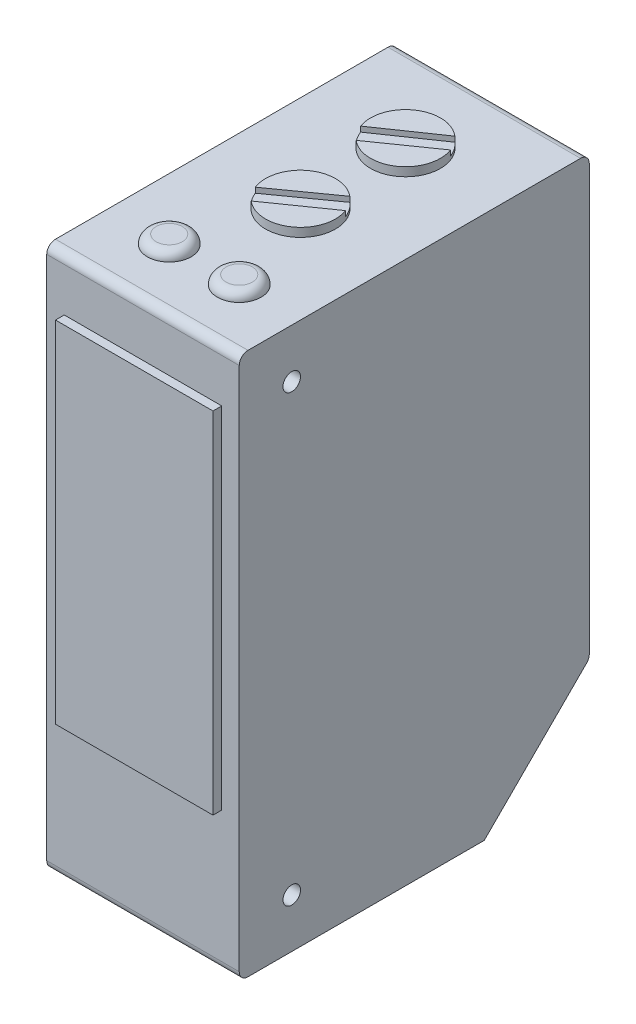
ISO-10303-21;
HEADER;
FILE_DESCRIPTION(('STEP AP214'),'2;1');
FILE_NAME('part.step','',(''),(''),'','','');
FILE_SCHEMA(('AUTOMOTIVE_DESIGN { 1 0 10303 214 1 1 1 1 }'));
ENDSEC;
DATA;
#1=APPLICATION_CONTEXT('core data for automotive mechanical design processes');
#2=APPLICATION_PROTOCOL_DEFINITION('international standard','automotive_design',2000,#1);
#3=PRODUCT_CONTEXT('',#1,'mechanical');
#4=PRODUCT('Part','Part','',(#3));
#5=PRODUCT_RELATED_PRODUCT_CATEGORY('part','',(#4));
#6=PRODUCT_DEFINITION_FORMATION('','',#4);
#7=PRODUCT_DEFINITION_CONTEXT('part definition',#1,'design');
#8=PRODUCT_DEFINITION('design','',#6,#7);
#9=PRODUCT_DEFINITION_SHAPE('','',#8);
#10=(LENGTH_UNIT() NAMED_UNIT(*) SI_UNIT(.MILLI.,.METRE.));
#11=(NAMED_UNIT(*) PLANE_ANGLE_UNIT() SI_UNIT($,.RADIAN.));
#12=(NAMED_UNIT(*) SI_UNIT($,.STERADIAN.) SOLID_ANGLE_UNIT());
#13=UNCERTAINTY_MEASURE_WITH_UNIT(LENGTH_MEASURE(1.E-05),#10,'distance_accuracy_value','');
#14=(GEOMETRIC_REPRESENTATION_CONTEXT(3) GLOBAL_UNCERTAINTY_ASSIGNED_CONTEXT((#13)) GLOBAL_UNIT_ASSIGNED_CONTEXT((#10,
#11,#12)) REPRESENTATION_CONTEXT('',''));
#15=CARTESIAN_POINT('',(0.,0.,0.));
#16=DIRECTION('',(0.,0.,1.));
#17=DIRECTION('',(1.,0.,0.));
#18=AXIS2_PLACEMENT_3D('',#15,#16,#17);
#19=CARTESIAN_POINT('',(5.5,31.5,-15.));
#20=DIRECTION('',(0.,1.,0.));
#21=DIRECTION('',(0.,0.,1.));
#22=AXIS2_PLACEMENT_3D('',#19,#20,#21);
#23=PLANE('',#22);
#24=DIRECTION('',(-0.824126188622013,0.,0.566406236924836));
#25=VECTOR('',#24,1.);
#26=CARTESIAN_POINT('',(3.62088337968436,31.5,-14.3152221329121));
#27=LINE('',#26,#25);
#28=CARTESIAN_POINT('',(6.81271038339081,31.5,-16.50890405571));
#29=VERTEX_POINT('',#28);
#30=CARTESIAN_POINT('',(3.62088337968436,31.5,-14.3152221329121));
#31=VERTEX_POINT('',#30);
#32=EDGE_CURVE('E220',#29,#31,#27,.T.);
#33=ORIENTED_EDGE('',*,*,#32,.F.);
#34=CARTESIAN_POINT('',(5.5,31.5,-15.));
#35=DIRECTION('',(0.,1.,0.));
#36=DIRECTION('',(0.,0.,1.));
#37=AXIS2_PLACEMENT_3D('',#34,#35,#36);
#38=CIRCLE('',#37,2.);
#39=EDGE_CURVE('E259',#29,#31,#38,.T.);
#40=ORIENTED_EDGE('',*,*,#39,.T.);
#41=EDGE_LOOP('',(#33,#40));
#42=FACE_BOUND('',#41,.T.);
#43=ADVANCED_FACE('F39',(#42),#23,.T.);
#44=CARTESIAN_POINT('',(5.5,31.5,-9.));
#45=DIRECTION('',(0.,1.,0.));
#46=DIRECTION('',(0.,0.,1.));
#47=AXIS2_PLACEMENT_3D('',#44,#45,#46);
#48=PLANE('',#47);
#49=DIRECTION('',(0.819152044288989,0.,-0.57357643635105));
#50=VECTOR('',#49,1.);
#51=CARTESIAN_POINT('',(4.20050710540402,31.5,-7.4796979849732));
#52=LINE('',#51,#50);
#53=CARTESIAN_POINT('',(4.20050710540401,31.5,-7.4796979849732));
#54=VERTEX_POINT('',#53);
#55=CARTESIAN_POINT('',(7.37306933094703,31.5,-9.70114997073782));
#56=VERTEX_POINT('',#55);
#57=EDGE_CURVE('E199',#54,#56,#52,.T.);
#58=ORIENTED_EDGE('',*,*,#57,.F.);
#59=CARTESIAN_POINT('',(5.5,31.5,-9.));
#60=DIRECTION('',(0.,1.,0.));
#61=DIRECTION('',(0.,0.,1.));
#62=AXIS2_PLACEMENT_3D('',#59,#60,#61);
#63=CIRCLE('',#62,2.);
#64=EDGE_CURVE('E250',#54,#56,#63,.T.);
#65=ORIENTED_EDGE('',*,*,#64,.T.);
#66=EDGE_LOOP('',(#58,#65));
#67=FACE_BOUND('',#66,.T.);
#68=ADVANCED_FACE('F482',(#67),#48,.T.);
#69=CARTESIAN_POINT('',(11.,0.,0.));
#70=DIRECTION('',(0.,0.,-1.));
#71=DIRECTION('',(-1.,0.,0.));
#72=AXIS2_PLACEMENT_3D('',#69,#70,#71);
#73=PLANE('',#72);
#74=DIRECTION('',(0.,-1.,0.));
#75=VECTOR('',#74,1.);
#76=CARTESIAN_POINT('',(0.,0.,0.));
#77=LINE('',#76,#75);
#78=CARTESIAN_POINT('',(0.,30.5,0.));
#79=VERTEX_POINT('',#78);
#80=CARTESIAN_POINT('',(0.,0.5,0.));
#81=VERTEX_POINT('',#80);
#82=EDGE_CURVE('E323',#79,#81,#77,.T.);
#83=ORIENTED_EDGE('',*,*,#82,.T.);
#84=DIRECTION('',(-1.,0.,0.));
#85=VECTOR('',#84,1.);
#86=CARTESIAN_POINT('',(11.,0.5,0.));
#87=LINE('',#86,#85);
#88=CARTESIAN_POINT('',(11.,0.5,0.));
#89=VERTEX_POINT('',#88);
#90=EDGE_CURVE('E417',#81,#89,#87,.F.);
#91=ORIENTED_EDGE('',*,*,#90,.T.);
#92=DIRECTION('',(0.,-1.,0.));
#93=VECTOR('',#92,1.);
#94=CARTESIAN_POINT('',(11.,0.,0.));
#95=LINE('',#94,#93);
#96=CARTESIAN_POINT('',(11.,30.5,0.));
#97=VERTEX_POINT('',#96);
#98=EDGE_CURVE('E333',#97,#89,#95,.T.);
#99=ORIENTED_EDGE('',*,*,#98,.F.);
#100=DIRECTION('',(-1.,0.,0.));
#101=VECTOR('',#100,1.);
#102=CARTESIAN_POINT('',(11.,30.5,0.));
#103=LINE('',#102,#101);
#104=EDGE_CURVE('E380',#97,#79,#103,.T.);
#105=ORIENTED_EDGE('',*,*,#104,.T.);
#106=EDGE_LOOP('',(#83,#91,#99,#105));
#107=FACE_BOUND('',#106,.T.);
#108=DIRECTION('',(1.,0.,0.));
#109=VECTOR('',#108,1.);
#110=CARTESIAN_POINT('',(1.,8.,0.));
#111=LINE('',#110,#109);
#112=CARTESIAN_POINT('',(1.,8.,0.));
#113=VERTEX_POINT('',#112);
#114=CARTESIAN_POINT('',(10.,8.,0.));
#115=VERTEX_POINT('',#114);
#116=EDGE_CURVE('E276',#113,#115,#111,.T.);
#117=ORIENTED_EDGE('',*,*,#116,.F.);
#118=DIRECTION('',(0.,-1.,0.));
#119=VECTOR('',#118,1.);
#120=CARTESIAN_POINT('',(0.999999999999997,28.,0.));
#121=LINE('',#120,#119);
#122=CARTESIAN_POINT('',(0.999999999999997,28.,0.));
#123=VERTEX_POINT('',#122);
#124=EDGE_CURVE('E264',#123,#113,#121,.T.);
#125=ORIENTED_EDGE('',*,*,#124,.F.);
#126=DIRECTION('',(1.,0.,0.));
#127=VECTOR('',#126,1.);
#128=CARTESIAN_POINT('',(0.999999999999997,28.,0.));
#129=LINE('',#128,#127);
#130=CARTESIAN_POINT('',(10.,28.,0.));
#131=VERTEX_POINT('',#130);
#132=EDGE_CURVE('E283',#123,#131,#129,.T.);
#133=ORIENTED_EDGE('',*,*,#132,.T.);
#134=DIRECTION('',(0.,-1.,0.));
#135=VECTOR('',#134,1.);
#136=CARTESIAN_POINT('',(10.,28.,0.));
#137=LINE('',#136,#135);
#138=EDGE_CURVE('E279',#131,#115,#137,.T.);
#139=ORIENTED_EDGE('',*,*,#138,.T.);
#140=EDGE_LOOP('',(#117,#125,#133,#139));
#141=FACE_BOUND('',#140,.T.);
#142=ADVANCED_FACE('F465',(#107,#141),#73,.F.);
#143=CARTESIAN_POINT('',(11.,0.,-14.));
#144=DIRECTION('',(0.,1.,0.));
#145=DIRECTION('',(0.,0.,1.));
#146=AXIS2_PLACEMENT_3D('',#143,#144,#145);
#147=PLANE('',#146);
#148=DIRECTION('',(0.,0.,-1.));
#149=VECTOR('',#148,1.);
#150=CARTESIAN_POINT('',(11.,0.,-14.));
#151=LINE('',#150,#149);
#152=CARTESIAN_POINT('',(11.,0.,-0.500000000000004));
#153=VERTEX_POINT('',#152);
#154=CARTESIAN_POINT('',(11.,0.,-14.));
#155=VERTEX_POINT('',#154);
#156=EDGE_CURVE('E319',#153,#155,#151,.T.);
#157=ORIENTED_EDGE('',*,*,#156,.F.);
#158=DIRECTION('',(-1.,0.,0.));
#159=VECTOR('',#158,1.);
#160=CARTESIAN_POINT('',(11.,0.,-0.5));
#161=LINE('',#160,#159);
#162=CARTESIAN_POINT('',(0.,0.,-0.500000000000004));
#163=VERTEX_POINT('',#162);
#164=EDGE_CURVE('E410',#153,#163,#161,.T.);
#165=ORIENTED_EDGE('',*,*,#164,.T.);
#166=DIRECTION('',(0.,0.,-1.));
#167=VECTOR('',#166,1.);
#168=CARTESIAN_POINT('',(0.,0.,-14.));
#169=LINE('',#168,#167);
#170=CARTESIAN_POINT('',(0.,0.,-14.));
#171=VERTEX_POINT('',#170);
#172=EDGE_CURVE('E307',#163,#171,#169,.T.);
#173=ORIENTED_EDGE('',*,*,#172,.T.);
#174=DIRECTION('',(-1.,0.,0.));
#175=VECTOR('',#174,1.);
#176=CARTESIAN_POINT('',(11.,0.,-14.));
#177=LINE('',#176,#175);
#178=EDGE_CURVE('E337',#155,#171,#177,.T.);
#179=ORIENTED_EDGE('',*,*,#178,.F.);
#180=EDGE_LOOP('',(#157,#165,#173,#179));
#181=FACE_BOUND('',#180,.T.);
#182=ADVANCED_FACE('F473',(#181),#147,.F.);
#183=CARTESIAN_POINT('',(11.,6.,-20.));
#184=DIRECTION('',(0.,0.707106781186546,0.707106781186549));
#185=DIRECTION('',(0.,-0.707106781186549,0.707106781186546));
#186=AXIS2_PLACEMENT_3D('',#183,#184,#185);
#187=PLANE('',#186);
#188=DIRECTION('',(0.,0.707106781186549,-0.707106781186546));
#189=VECTOR('',#188,1.);
#190=CARTESIAN_POINT('',(0.,6.,-20.));
#191=LINE('',#190,#189);
#192=CARTESIAN_POINT('',(0.,5.85355339059327,-19.8535533905933));
#193=VERTEX_POINT('',#192);
#194=EDGE_CURVE('E340',#171,#193,#191,.T.);
#195=ORIENTED_EDGE('',*,*,#194,.T.);
#196=DIRECTION('',(-1.,0.,0.));
#197=VECTOR('',#196,1.);
#198=CARTESIAN_POINT('',(11.,5.85355339059327,-19.8535533905933));
#199=LINE('',#198,#197);
#200=CARTESIAN_POINT('',(11.,5.85355339059327,-19.8535533905933));
#201=VERTEX_POINT('',#200);
#202=EDGE_CURVE('E48',#193,#201,#199,.F.);
#203=ORIENTED_EDGE('',*,*,#202,.T.);
#204=DIRECTION('',(0.,0.707106781186549,-0.707106781186546));
#205=VECTOR('',#204,1.);
#206=CARTESIAN_POINT('',(11.,6.,-20.));
#207=LINE('',#206,#205);
#208=EDGE_CURVE('E322',#155,#201,#207,.T.);
#209=ORIENTED_EDGE('',*,*,#208,.F.);
#210=ORIENTED_EDGE('',*,*,#178,.T.);
#211=EDGE_LOOP('',(#195,#203,#209,#210));
#212=FACE_BOUND('',#211,.T.);
#213=ADVANCED_FACE('F433',(#212),#187,.F.);
#214=CARTESIAN_POINT('',(11.,31.,-20.));
#215=DIRECTION('',(0.,0.,1.));
#216=DIRECTION('',(0.,-1.,0.));
#217=AXIS2_PLACEMENT_3D('',#214,#215,#216);
#218=PLANE('',#217);
#219=DIRECTION('',(0.,1.,0.));
#220=VECTOR('',#219,1.);
#221=CARTESIAN_POINT('',(11.,31.,-20.));
#222=LINE('',#221,#220);
#223=CARTESIAN_POINT('',(11.,6.20710678118655,-20.));
#224=VERTEX_POINT('',#223);
#225=CARTESIAN_POINT('',(11.,30.5,-20.));
#226=VERTEX_POINT('',#225);
#227=EDGE_CURVE('E327',#224,#226,#222,.T.);
#228=ORIENTED_EDGE('',*,*,#227,.F.);
#229=DIRECTION('',(-1.,0.,0.));
#230=VECTOR('',#229,1.);
#231=CARTESIAN_POINT('',(11.,6.20710678118655,-20.));
#232=LINE('',#231,#230);
#233=CARTESIAN_POINT('',(0.,6.20710678118655,-20.));
#234=VERTEX_POINT('',#233);
#235=EDGE_CURVE('E423',#224,#234,#232,.T.);
#236=ORIENTED_EDGE('',*,*,#235,.T.);
#237=DIRECTION('',(0.,1.,0.));
#238=VECTOR('',#237,1.);
#239=CARTESIAN_POINT('',(0.,31.,-20.));
#240=LINE('',#239,#238);
#241=CARTESIAN_POINT('',(0.,30.5,-20.));
#242=VERTEX_POINT('',#241);
#243=EDGE_CURVE('E344',#234,#242,#240,.T.);
#244=ORIENTED_EDGE('',*,*,#243,.T.);
#245=DIRECTION('',(-1.,0.,0.));
#246=VECTOR('',#245,1.);
#247=CARTESIAN_POINT('',(11.,30.5,-20.));
#248=LINE('',#247,#246);
#249=EDGE_CURVE('E403',#242,#226,#248,.F.);
#250=ORIENTED_EDGE('',*,*,#249,.T.);
#251=EDGE_LOOP('',(#228,#236,#244,#250));
#252=FACE_BOUND('',#251,.T.);
#253=ADVANCED_FACE('F445',(#252),#218,.F.);
#254=CARTESIAN_POINT('',(11.,31.,0.));
#255=DIRECTION('',(0.,-1.,0.));
#256=DIRECTION('',(0.,0.,-1.));
#257=AXIS2_PLACEMENT_3D('',#254,#255,#256);
#258=PLANE('',#257);
#259=CARTESIAN_POINT('',(5.5,31.,-9.));
#260=DIRECTION('',(0.,-1.,0.));
#261=DIRECTION('',(0.,0.,-1.));
#262=AXIS2_PLACEMENT_3D('',#259,#260,#261);
#263=CIRCLE('',#262,2.);
#264=CARTESIAN_POINT('',(5.5,31.,-11.));
#265=VERTEX_POINT('',#264);
#266=EDGE_CURVE('E368',#265,#265,#263,.F.);
#267=ORIENTED_EDGE('',*,*,#266,.F.);
#268=EDGE_LOOP('',(#267));
#269=FACE_BOUND('',#268,.T.);
#270=CARTESIAN_POINT('',(5.5,31.,-15.));
#271=DIRECTION('',(0.,-1.,0.));
#272=DIRECTION('',(0.,0.,-1.));
#273=AXIS2_PLACEMENT_3D('',#270,#271,#272);
#274=CIRCLE('',#273,2.);
#275=CARTESIAN_POINT('',(5.5,31.,-17.));
#276=VERTEX_POINT('',#275);
#277=EDGE_CURVE('E364',#276,#276,#274,.F.);
#278=ORIENTED_EDGE('',*,*,#277,.F.);
#279=EDGE_LOOP('',(#278));
#280=FACE_BOUND('',#279,.T.);
#281=CARTESIAN_POINT('',(7.5,31.,-3.5));
#282=DIRECTION('',(0.,-1.,0.));
#283=DIRECTION('',(0.,0.,-1.));
#284=AXIS2_PLACEMENT_3D('',#281,#282,#283);
#285=CIRCLE('',#284,1.25);
#286=CARTESIAN_POINT('',(7.5,31.,-4.75));
#287=VERTEX_POINT('',#286);
#288=EDGE_CURVE('E360',#287,#287,#285,.F.);
#289=ORIENTED_EDGE('',*,*,#288,.F.);
#290=EDGE_LOOP('',(#289));
#291=FACE_BOUND('',#290,.T.);
#292=CARTESIAN_POINT('',(3.5,31.,-3.5));
#293=DIRECTION('',(0.,-1.,0.));
#294=DIRECTION('',(0.,0.,-1.));
#295=AXIS2_PLACEMENT_3D('',#292,#293,#294);
#296=CIRCLE('',#295,1.25);
#297=CARTESIAN_POINT('',(3.5,31.,-4.75));
#298=VERTEX_POINT('',#297);
#299=EDGE_CURVE('E356',#298,#298,#296,.F.);
#300=ORIENTED_EDGE('',*,*,#299,.F.);
#301=EDGE_LOOP('',(#300));
#302=FACE_BOUND('',#301,.T.);
#303=DIRECTION('',(0.,0.,1.));
#304=VECTOR('',#303,1.);
#305=CARTESIAN_POINT('',(11.,31.,0.));
#306=LINE('',#305,#304);
#307=CARTESIAN_POINT('',(11.,31.,-19.5));
#308=VERTEX_POINT('',#307);
#309=CARTESIAN_POINT('',(11.,31.,-0.5));
#310=VERTEX_POINT('',#309);
#311=EDGE_CURVE('E330',#308,#310,#306,.T.);
#312=ORIENTED_EDGE('',*,*,#311,.F.);
#313=DIRECTION('',(-1.,0.,0.));
#314=VECTOR('',#313,1.);
#315=CARTESIAN_POINT('',(11.,31.,-19.5));
#316=LINE('',#315,#314);
#317=CARTESIAN_POINT('',(0.,31.,-19.5));
#318=VERTEX_POINT('',#317);
#319=EDGE_CURVE('E395',#308,#318,#316,.T.);
#320=ORIENTED_EDGE('',*,*,#319,.T.);
#321=DIRECTION('',(0.,0.,1.));
#322=VECTOR('',#321,1.);
#323=CARTESIAN_POINT('',(0.,31.,0.));
#324=LINE('',#323,#322);
#325=CARTESIAN_POINT('',(0.,31.,-0.5));
#326=VERTEX_POINT('',#325);
#327=EDGE_CURVE('E347',#318,#326,#324,.T.);
#328=ORIENTED_EDGE('',*,*,#327,.T.);
#329=DIRECTION('',(-1.,0.,0.));
#330=VECTOR('',#329,1.);
#331=CARTESIAN_POINT('',(11.,31.,-0.5));
#332=LINE('',#331,#330);
#333=EDGE_CURVE('E388',#326,#310,#332,.F.);
#334=ORIENTED_EDGE('',*,*,#333,.T.);
#335=EDGE_LOOP('',(#312,#320,#328,#334));
#336=FACE_BOUND('',#335,.T.);
#337=ADVANCED_FACE('F456',(#269,#280,#291,#302,#336),#258,.F.);
#338=CARTESIAN_POINT('',(11.,0.,0.));
#339=DIRECTION('',(-1.,0.,0.));
#340=DIRECTION('',(0.,0.,1.));
#341=AXIS2_PLACEMENT_3D('',#338,#339,#340);
#342=PLANE('',#341);
#343=CARTESIAN_POINT('',(11.,2.8,-3.));
#344=DIRECTION('',(1.,0.,0.));
#345=DIRECTION('',(0.,0.,-1.));
#346=AXIS2_PLACEMENT_3D('',#343,#344,#345);
#347=CIRCLE('',#346,0.5);
#348=CARTESIAN_POINT('',(11.,2.8,-3.5));
#349=VERTEX_POINT('',#348);
#350=EDGE_CURVE('E308',#349,#349,#347,.T.);
#351=ORIENTED_EDGE('',*,*,#350,.F.);
#352=EDGE_LOOP('',(#351));
#353=FACE_BOUND('',#352,.T.);
#354=CARTESIAN_POINT('',(11.,28.2,-3.));
#355=DIRECTION('',(1.,0.,0.));
#356=DIRECTION('',(0.,0.,-1.));
#357=AXIS2_PLACEMENT_3D('',#354,#355,#356);
#358=CIRCLE('',#357,0.5);
#359=CARTESIAN_POINT('',(11.,28.2,-3.5));
#360=VERTEX_POINT('',#359);
#361=EDGE_CURVE('E302',#360,#360,#358,.T.);
#362=ORIENTED_EDGE('',*,*,#361,.F.);
#363=EDGE_LOOP('',(#362));
#364=FACE_BOUND('',#363,.T.);
#365=ORIENTED_EDGE('',*,*,#208,.T.);
#366=CARTESIAN_POINT('',(11.,6.20710678118655,-19.5));
#367=DIRECTION('',(-1.,0.,0.));
#368=DIRECTION('',(0.,0.,1.));
#369=AXIS2_PLACEMENT_3D('',#366,#367,#368);
#370=CIRCLE('',#369,0.5);
#371=EDGE_CURVE('E11',#201,#224,#370,.F.);
#372=ORIENTED_EDGE('',*,*,#371,.T.);
#373=ORIENTED_EDGE('',*,*,#227,.T.);
#374=CARTESIAN_POINT('',(11.,30.5,-19.5));
#375=DIRECTION('',(-1.,0.,0.));
#376=DIRECTION('',(0.,0.,1.));
#377=AXIS2_PLACEMENT_3D('',#374,#375,#376);
#378=CIRCLE('',#377,0.5);
#379=EDGE_CURVE('E407',#226,#308,#378,.F.);
#380=ORIENTED_EDGE('',*,*,#379,.T.);
#381=ORIENTED_EDGE('',*,*,#311,.T.);
#382=CARTESIAN_POINT('',(11.,30.5,-0.5));
#383=DIRECTION('',(-1.,0.,0.));
#384=DIRECTION('',(0.,0.,1.));
#385=AXIS2_PLACEMENT_3D('',#382,#383,#384);
#386=CIRCLE('',#385,0.5);
#387=EDGE_CURVE('E392',#310,#97,#386,.F.);
#388=ORIENTED_EDGE('',*,*,#387,.T.);
#389=ORIENTED_EDGE('',*,*,#98,.T.);
#390=CARTESIAN_POINT('',(11.,0.5,-0.5));
#391=DIRECTION('',(-1.,0.,0.));
#392=DIRECTION('',(0.,0.,1.));
#393=AXIS2_PLACEMENT_3D('',#390,#391,#392);
#394=CIRCLE('',#393,0.5);
#395=EDGE_CURVE('E420',#89,#153,#394,.F.);
#396=ORIENTED_EDGE('',*,*,#395,.T.);
#397=ORIENTED_EDGE('',*,*,#156,.T.);
#398=EDGE_LOOP('',(#365,#372,#373,#380,#381,#388,#389,#396,#397));
#399=FACE_BOUND('',#398,.T.);
#400=ADVANCED_FACE('F439',(#353,#364,#399),#342,.F.);
#401=CARTESIAN_POINT('',(0.,0.,0.));
#402=DIRECTION('',(-1.,0.,0.));
#403=DIRECTION('',(0.,0.,1.));
#404=AXIS2_PLACEMENT_3D('',#401,#402,#403);
#405=PLANE('',#404);
#406=CARTESIAN_POINT('',(0.,2.8,-3.));
#407=DIRECTION('',(1.,0.,0.));
#408=DIRECTION('',(0.,0.,-1.));
#409=AXIS2_PLACEMENT_3D('',#406,#407,#408);
#410=CIRCLE('',#409,0.5);
#411=CARTESIAN_POINT('',(0.,2.8,-3.5));
#412=VERTEX_POINT('',#411);
#413=EDGE_CURVE('E303',#412,#412,#410,.T.);
#414=ORIENTED_EDGE('',*,*,#413,.T.);
#415=EDGE_LOOP('',(#414));
#416=FACE_BOUND('',#415,.T.);
#417=CARTESIAN_POINT('',(0.,28.2,-3.));
#418=DIRECTION('',(1.,0.,0.));
#419=DIRECTION('',(0.,0.,-1.));
#420=AXIS2_PLACEMENT_3D('',#417,#418,#419);
#421=CIRCLE('',#420,0.5);
#422=CARTESIAN_POINT('',(0.,28.2,-3.5));
#423=VERTEX_POINT('',#422);
#424=EDGE_CURVE('E312',#423,#423,#421,.T.);
#425=ORIENTED_EDGE('',*,*,#424,.T.);
#426=EDGE_LOOP('',(#425));
#427=FACE_BOUND('',#426,.T.);
#428=ORIENTED_EDGE('',*,*,#243,.F.);
#429=CARTESIAN_POINT('',(0.,6.20710678118655,-19.5));
#430=DIRECTION('',(-1.,0.,0.));
#431=DIRECTION('',(0.,0.,1.));
#432=AXIS2_PLACEMENT_3D('',#429,#430,#431);
#433=CIRCLE('',#432,0.5);
#434=EDGE_CURVE('E427',#234,#193,#433,.T.);
#435=ORIENTED_EDGE('',*,*,#434,.T.);
#436=ORIENTED_EDGE('',*,*,#194,.F.);
#437=ORIENTED_EDGE('',*,*,#172,.F.);
#438=CARTESIAN_POINT('',(0.,0.5,-0.5));
#439=DIRECTION('',(-1.,0.,0.));
#440=DIRECTION('',(0.,0.,1.));
#441=AXIS2_PLACEMENT_3D('',#438,#439,#440);
#442=CIRCLE('',#441,0.5);
#443=EDGE_CURVE('E414',#163,#81,#442,.T.);
#444=ORIENTED_EDGE('',*,*,#443,.T.);
#445=ORIENTED_EDGE('',*,*,#82,.F.);
#446=CARTESIAN_POINT('',(0.,30.5,-0.5));
#447=DIRECTION('',(-1.,0.,0.));
#448=DIRECTION('',(0.,0.,1.));
#449=AXIS2_PLACEMENT_3D('',#446,#447,#448);
#450=CIRCLE('',#449,0.5);
#451=EDGE_CURVE('E384',#79,#326,#450,.T.);
#452=ORIENTED_EDGE('',*,*,#451,.T.);
#453=ORIENTED_EDGE('',*,*,#327,.F.);
#454=CARTESIAN_POINT('',(0.,30.5,-19.5));
#455=DIRECTION('',(-1.,0.,0.));
#456=DIRECTION('',(0.,0.,1.));
#457=AXIS2_PLACEMENT_3D('',#454,#455,#456);
#458=CIRCLE('',#457,0.5);
#459=EDGE_CURVE('E399',#318,#242,#458,.T.);
#460=ORIENTED_EDGE('',*,*,#459,.T.);
#461=EDGE_LOOP('',(#428,#435,#436,#437,#444,#445,#452,#453,#460));
#462=FACE_BOUND('',#461,.T.);
#463=ADVANCED_FACE('F447',(#416,#427,#462),#405,.T.);
#464=CARTESIAN_POINT('',(0.,28.2,-3.));
#465=DIRECTION('',(1.,0.,0.));
#466=DIRECTION('',(0.,0.,-1.));
#467=AXIS2_PLACEMENT_3D('',#464,#465,#466);
#468=CYLINDRICAL_SURFACE('',#467,0.5);
#469=ORIENTED_EDGE('',*,*,#424,.F.);
#470=EDGE_LOOP('',(#469));
#471=FACE_BOUND('',#470,.T.);
#472=ORIENTED_EDGE('',*,*,#361,.T.);
#473=EDGE_LOOP('',(#472));
#474=FACE_BOUND('',#473,.T.);
#475=ADVANCED_FACE('F717',(#471,#474),#468,.F.);
#476=CARTESIAN_POINT('',(0.,2.8,-3.));
#477=DIRECTION('',(1.,0.,0.));
#478=DIRECTION('',(0.,0.,-1.));
#479=AXIS2_PLACEMENT_3D('',#476,#477,#478);
#480=CYLINDRICAL_SURFACE('',#479,0.5);
#481=ORIENTED_EDGE('',*,*,#413,.F.);
#482=EDGE_LOOP('',(#481));
#483=FACE_BOUND('',#482,.T.);
#484=ORIENTED_EDGE('',*,*,#350,.T.);
#485=EDGE_LOOP('',(#484));
#486=FACE_BOUND('',#485,.T.);
#487=ADVANCED_FACE('F724',(#483,#486),#480,.F.);
#488=CARTESIAN_POINT('',(1.,8.,0.5));
#489=DIRECTION('',(0.,1.,0.));
#490=DIRECTION('',(0.,0.,1.));
#491=AXIS2_PLACEMENT_3D('',#488,#489,#490);
#492=PLANE('',#491);
#493=ORIENTED_EDGE('',*,*,#116,.T.);
#494=DIRECTION('',(0.,0.,-1.));
#495=VECTOR('',#494,1.);
#496=CARTESIAN_POINT('',(10.,8.,0.5));
#497=LINE('',#496,#495);
#498=CARTESIAN_POINT('',(10.,8.,0.5));
#499=VERTEX_POINT('',#498);
#500=EDGE_CURVE('E298',#499,#115,#497,.T.);
#501=ORIENTED_EDGE('',*,*,#500,.F.);
#502=DIRECTION('',(1.,0.,0.));
#503=VECTOR('',#502,1.);
#504=CARTESIAN_POINT('',(1.,8.,0.5));
#505=LINE('',#504,#503);
#506=CARTESIAN_POINT('',(1.,8.,0.5));
#507=VERTEX_POINT('',#506);
#508=EDGE_CURVE('E260',#507,#499,#505,.T.);
#509=ORIENTED_EDGE('',*,*,#508,.F.);
#510=DIRECTION('',(0.,0.,-1.));
#511=VECTOR('',#510,1.);
#512=CARTESIAN_POINT('',(1.,8.,0.5));
#513=LINE('',#512,#511);
#514=EDGE_CURVE('E275',#507,#113,#513,.T.);
#515=ORIENTED_EDGE('',*,*,#514,.T.);
#516=EDGE_LOOP('',(#493,#501,#509,#515));
#517=FACE_BOUND('',#516,.T.);
#518=ADVANCED_FACE('F732',(#517),#492,.F.);
#519=CARTESIAN_POINT('',(10.,28.,0.5));
#520=DIRECTION('',(1.,0.,0.));
#521=DIRECTION('',(0.,1.,0.));
#522=AXIS2_PLACEMENT_3D('',#519,#520,#521);
#523=PLANE('',#522);
#524=ORIENTED_EDGE('',*,*,#138,.F.);
#525=DIRECTION('',(0.,0.,-1.));
#526=VECTOR('',#525,1.);
#527=CARTESIAN_POINT('',(10.,28.,0.5));
#528=LINE('',#527,#526);
#529=CARTESIAN_POINT('',(10.,28.,0.5));
#530=VERTEX_POINT('',#529);
#531=EDGE_CURVE('E295',#530,#131,#528,.T.);
#532=ORIENTED_EDGE('',*,*,#531,.F.);
#533=DIRECTION('',(0.,-1.,0.));
#534=VECTOR('',#533,1.);
#535=CARTESIAN_POINT('',(10.,28.,0.5));
#536=LINE('',#535,#534);
#537=EDGE_CURVE('E263',#530,#499,#536,.T.);
#538=ORIENTED_EDGE('',*,*,#537,.T.);
#539=ORIENTED_EDGE('',*,*,#500,.T.);
#540=EDGE_LOOP('',(#524,#532,#538,#539));
#541=FACE_BOUND('',#540,.T.);
#542=ADVANCED_FACE('F741',(#541),#523,.T.);
#543=CARTESIAN_POINT('',(0.999999999999997,28.,0.5));
#544=DIRECTION('',(0.,1.,0.));
#545=DIRECTION('',(0.,0.,1.));
#546=AXIS2_PLACEMENT_3D('',#543,#544,#545);
#547=PLANE('',#546);
#548=ORIENTED_EDGE('',*,*,#132,.F.);
#549=DIRECTION('',(0.,0.,-1.));
#550=VECTOR('',#549,1.);
#551=CARTESIAN_POINT('',(0.999999999999997,28.,0.5));
#552=LINE('',#551,#550);
#553=CARTESIAN_POINT('',(0.999999999999997,28.,0.5));
#554=VERTEX_POINT('',#553);
#555=EDGE_CURVE('E292',#554,#123,#552,.T.);
#556=ORIENTED_EDGE('',*,*,#555,.F.);
#557=DIRECTION('',(1.,0.,0.));
#558=VECTOR('',#557,1.);
#559=CARTESIAN_POINT('',(0.999999999999997,28.,0.5));
#560=LINE('',#559,#558);
#561=EDGE_CURVE('E268',#554,#530,#560,.T.);
#562=ORIENTED_EDGE('',*,*,#561,.T.);
#563=ORIENTED_EDGE('',*,*,#531,.T.);
#564=EDGE_LOOP('',(#548,#556,#562,#563));
#565=FACE_BOUND('',#564,.T.);
#566=ADVANCED_FACE('F751',(#565),#547,.T.);
#567=CARTESIAN_POINT('',(0.999999999999997,28.,0.5));
#568=DIRECTION('',(1.,0.,0.));
#569=DIRECTION('',(0.,1.,0.));
#570=AXIS2_PLACEMENT_3D('',#567,#568,#569);
#571=PLANE('',#570);
#572=ORIENTED_EDGE('',*,*,#124,.T.);
#573=ORIENTED_EDGE('',*,*,#514,.F.);
#574=DIRECTION('',(0.,-1.,0.));
#575=VECTOR('',#574,1.);
#576=CARTESIAN_POINT('',(0.999999999999997,28.,0.5));
#577=LINE('',#576,#575);
#578=EDGE_CURVE('E272',#554,#507,#577,.T.);
#579=ORIENTED_EDGE('',*,*,#578,.F.);
#580=ORIENTED_EDGE('',*,*,#555,.T.);
#581=EDGE_LOOP('',(#572,#573,#579,#580));
#582=FACE_BOUND('',#581,.T.);
#583=ADVANCED_FACE('F761',(#582),#571,.F.);
#584=CARTESIAN_POINT('',(0.,0.,0.5));
#585=DIRECTION('',(0.,0.,-1.));
#586=DIRECTION('',(-1.,0.,0.));
#587=AXIS2_PLACEMENT_3D('',#584,#585,#586);
#588=PLANE('',#587);
#589=ORIENTED_EDGE('',*,*,#508,.T.);
#590=ORIENTED_EDGE('',*,*,#537,.F.);
#591=ORIENTED_EDGE('',*,*,#561,.F.);
#592=ORIENTED_EDGE('',*,*,#578,.T.);
#593=EDGE_LOOP('',(#589,#590,#591,#592));
#594=FACE_BOUND('',#593,.T.);
#595=ADVANCED_FACE('F771',(#594),#588,.F.);
#596=CARTESIAN_POINT('',(3.5,31.5,-3.5));
#597=DIRECTION('',(0.,1.,0.));
#598=DIRECTION('',(0.,0.,1.));
#599=AXIS2_PLACEMENT_3D('',#596,#597,#598);
#600=PLANE('',#599);
#601=CARTESIAN_POINT('',(3.5,31.5,-3.5));
#602=DIRECTION('',(0.,1.,0.));
#603=DIRECTION('',(0.,0.,1.));
#604=AXIS2_PLACEMENT_3D('',#601,#602,#603);
#605=CIRCLE('',#604,0.749999999999999);
#606=CARTESIAN_POINT('',(3.5,31.5,-2.75));
#607=VERTEX_POINT('',#606);
#608=EDGE_CURVE('E372',#607,#607,#605,.T.);
#609=ORIENTED_EDGE('',*,*,#608,.T.);
#610=EDGE_LOOP('',(#609));
#611=FACE_BOUND('',#610,.T.);
#612=ADVANCED_FACE('F780',(#611),#600,.T.);
#613=CARTESIAN_POINT('',(7.5,31.5,-3.5));
#614=DIRECTION('',(0.,1.,0.));
#615=DIRECTION('',(0.,0.,1.));
#616=AXIS2_PLACEMENT_3D('',#613,#614,#615);
#617=PLANE('',#616);
#618=CARTESIAN_POINT('',(7.5,31.5,-3.5));
#619=DIRECTION('',(0.,1.,0.));
#620=DIRECTION('',(0.,0.,1.));
#621=AXIS2_PLACEMENT_3D('',#618,#619,#620);
#622=CIRCLE('',#621,0.749999999999999);
#623=CARTESIAN_POINT('',(7.5,31.5,-2.75));
#624=VERTEX_POINT('',#623);
#625=EDGE_CURVE('E376',#624,#624,#622,.T.);
#626=ORIENTED_EDGE('',*,*,#625,.T.);
#627=EDGE_LOOP('',(#626));
#628=FACE_BOUND('',#627,.T.);
#629=ADVANCED_FACE('F505',(#628),#617,.T.);
#630=CARTESIAN_POINT('',(5.5,31.5,-15.));
#631=DIRECTION('',(0.,-1.,0.));
#632=DIRECTION('',(0.,0.,-1.));
#633=AXIS2_PLACEMENT_3D('',#630,#631,#632);
#634=CYLINDRICAL_SURFACE('',#633,2.);
#635=ORIENTED_EDGE('',*,*,#39,.F.);
#636=DIRECTION('',(0.,1.,0.));
#637=VECTOR('',#636,1.);
#638=CARTESIAN_POINT('',(6.81271038339081,31.2,-16.50890405571));
#639=LINE('',#638,#637);
#640=CARTESIAN_POINT('',(6.81271038339081,31.2,-16.50890405571));
#641=VERTEX_POINT('',#640);
#642=EDGE_CURVE('E241',#641,#29,#639,.T.);
#643=ORIENTED_EDGE('',*,*,#642,.F.);
#644=CARTESIAN_POINT('',(5.5,31.2,-15.));
#645=DIRECTION('',(0.,1.,0.));
#646=DIRECTION('',(0.,0.,1.));
#647=AXIS2_PLACEMENT_3D('',#644,#645,#646);
#648=CIRCLE('',#647,2.);
#649=CARTESIAN_POINT('',(7.37306933094703,31.2,-15.7011499707378));
#650=VERTEX_POINT('',#649);
#651=EDGE_CURVE('E224',#650,#641,#648,.T.);
#652=ORIENTED_EDGE('',*,*,#651,.F.);
#653=DIRECTION('',(0.,1.,0.));
#654=VECTOR('',#653,1.);
#655=CARTESIAN_POINT('',(7.37306933094703,31.2,-15.7011499707378));
#656=LINE('',#655,#654);
#657=CARTESIAN_POINT('',(7.37306933094703,31.5,-15.7011499707378));
#658=VERTEX_POINT('',#657);
#659=EDGE_CURVE('E244',#650,#658,#656,.T.);
#660=ORIENTED_EDGE('',*,*,#659,.T.);
#661=CARTESIAN_POINT('',(4.20050710540401,31.5,-13.4796979849732));
#662=VERTEX_POINT('',#661);
#663=EDGE_CURVE('E255',#662,#658,#38,.T.);
#664=ORIENTED_EDGE('',*,*,#663,.F.);
#665=DIRECTION('',(0.,1.,0.));
#666=VECTOR('',#665,1.);
#667=CARTESIAN_POINT('',(4.20050710540402,31.2,-13.4796979849732));
#668=LINE('',#667,#666);
#669=CARTESIAN_POINT('',(4.20050710540402,31.2,-13.4796979849732));
#670=VERTEX_POINT('',#669);
#671=EDGE_CURVE('E55',#670,#662,#668,.T.);
#672=ORIENTED_EDGE('',*,*,#671,.F.);
#673=CARTESIAN_POINT('',(5.5,31.2,-15.));
#674=DIRECTION('',(0.,1.,0.));
#675=DIRECTION('',(0.,0.,1.));
#676=AXIS2_PLACEMENT_3D('',#673,#674,#675);
#677=CIRCLE('',#676,2.);
#678=CARTESIAN_POINT('',(3.62088337968436,31.2,-14.3152221329121));
#679=VERTEX_POINT('',#678);
#680=EDGE_CURVE('E215',#679,#670,#677,.T.);
#681=ORIENTED_EDGE('',*,*,#680,.F.);
#682=DIRECTION('',(0.,1.,0.));
#683=VECTOR('',#682,1.);
#684=CARTESIAN_POINT('',(3.62088337968436,31.2,-14.3152221329121));
#685=LINE('',#684,#683);
#686=EDGE_CURVE('E236',#679,#31,#685,.T.);
#687=ORIENTED_EDGE('',*,*,#686,.T.);
#688=EDGE_LOOP('',(#635,#643,#652,#660,#664,#672,#681,#687));
#689=FACE_BOUND('',#688,.T.);
#690=ORIENTED_EDGE('',*,*,#277,.T.);
#691=EDGE_LOOP('',(#690));
#692=FACE_BOUND('',#691,.T.);
#693=ADVANCED_FACE('F499',(#689,#692),#634,.T.);
#694=DIRECTION('',(0.819152044288989,0.,-0.573576436351051));
#695=VECTOR('',#694,1.);
#696=CARTESIAN_POINT('',(4.20050710540402,31.5,-13.4796979849732));
#697=LINE('',#696,#695);
#698=EDGE_CURVE('E231',#662,#658,#697,.T.);
#699=ORIENTED_EDGE('',*,*,#698,.F.);
#700=ORIENTED_EDGE('',*,*,#663,.T.);
#701=EDGE_LOOP('',(#699,#700));
#702=FACE_BOUND('',#701,.T.);
#703=ADVANCED_FACE('F488',(#702),#23,.T.);
#704=CARTESIAN_POINT('',(5.5,31.5,-9.));
#705=DIRECTION('',(0.,-1.,0.));
#706=DIRECTION('',(0.,0.,-1.));
#707=AXIS2_PLACEMENT_3D('',#704,#705,#706);
#708=CYLINDRICAL_SURFACE('',#707,2.);
#709=CARTESIAN_POINT('',(5.5,31.2,-9.));
#710=DIRECTION('',(0.,1.,0.));
#711=DIRECTION('',(0.,0.,1.));
#712=AXIS2_PLACEMENT_3D('',#709,#710,#711);
#713=CIRCLE('',#712,2.);
#714=CARTESIAN_POINT('',(7.37306933094703,31.2,-9.70114997073782));
#715=VERTEX_POINT('',#714);
#716=CARTESIAN_POINT('',(6.78617644438605,31.2,-10.5315841974591));
#717=VERTEX_POINT('',#716);
#718=EDGE_CURVE('E189',#715,#717,#713,.T.);
#719=ORIENTED_EDGE('',*,*,#718,.F.);
#720=DIRECTION('',(0.,1.,0.));
#721=VECTOR('',#720,1.);
#722=CARTESIAN_POINT('',(7.37306933094703,31.2,-9.70114997073782));
#723=LINE('',#722,#721);
#724=EDGE_CURVE('E254',#715,#56,#723,.T.);
#725=ORIENTED_EDGE('',*,*,#724,.T.);
#726=ORIENTED_EDGE('',*,*,#64,.F.);
#727=DIRECTION('',(0.,1.,0.));
#728=VECTOR('',#727,1.);
#729=CARTESIAN_POINT('',(4.20050710540401,31.2,-7.4796979849732));
#730=LINE('',#729,#728);
#731=CARTESIAN_POINT('',(4.20050710540401,31.2,-7.4796979849732));
#732=VERTEX_POINT('',#731);
#733=EDGE_CURVE('E210',#732,#54,#730,.T.);
#734=ORIENTED_EDGE('',*,*,#733,.F.);
#735=CARTESIAN_POINT('',(5.5,31.2,-9.));
#736=DIRECTION('',(0.,1.,0.));
#737=DIRECTION('',(0.,0.,1.));
#738=AXIS2_PLACEMENT_3D('',#735,#736,#737);
#739=CIRCLE('',#738,2.);
#740=CARTESIAN_POINT('',(3.633120599903,31.2,-8.28253132089723));
#741=VERTEX_POINT('',#740);
#742=EDGE_CURVE('E188',#741,#732,#739,.T.);
#743=ORIENTED_EDGE('',*,*,#742,.F.);
#744=DIRECTION('',(0.,1.,0.));
#745=VECTOR('',#744,1.);
#746=CARTESIAN_POINT('',(3.633120599903,31.2,-8.28253132089723));
#747=LINE('',#746,#745);
#748=CARTESIAN_POINT('',(3.633120599903,31.5,-8.28253132089723));
#749=VERTEX_POINT('',#748);
#750=EDGE_CURVE('E184',#741,#749,#747,.T.);
#751=ORIENTED_EDGE('',*,*,#750,.T.);
#752=CARTESIAN_POINT('',(6.78617644438605,31.5,-10.5315841974591));
#753=VERTEX_POINT('',#752);
#754=EDGE_CURVE('E205',#753,#749,#63,.T.);
#755=ORIENTED_EDGE('',*,*,#754,.F.);
#756=DIRECTION('',(0.,1.,0.));
#757=VECTOR('',#756,1.);
#758=CARTESIAN_POINT('',(6.78617644438605,31.2,-10.5315841974591));
#759=LINE('',#758,#757);
#760=EDGE_CURVE('E63',#717,#753,#759,.T.);
#761=ORIENTED_EDGE('',*,*,#760,.F.);
#762=EDGE_LOOP('',(#719,#725,#726,#734,#743,#751,#755,#761));
#763=FACE_BOUND('',#762,.T.);
#764=ORIENTED_EDGE('',*,*,#266,.T.);
#765=EDGE_LOOP('',(#764));
#766=FACE_BOUND('',#765,.T.);
#767=ADVANCED_FACE('F202',(#763,#766),#708,.T.);
#768=DIRECTION('',(-0.81411551835632,0.,0.580702955710938));
#769=VECTOR('',#768,1.);
#770=CARTESIAN_POINT('',(6.78617644438605,31.5,-10.5315841974591));
#771=LINE('',#770,#769);
#772=EDGE_CURVE('E240',#753,#749,#771,.T.);
#773=ORIENTED_EDGE('',*,*,#772,.F.);
#774=ORIENTED_EDGE('',*,*,#754,.T.);
#775=EDGE_LOOP('',(#773,#774));
#776=FACE_BOUND('',#775,.T.);
#777=ADVANCED_FACE('F494',(#776),#48,.T.);
#778=CARTESIAN_POINT('',(3.5,31.,-3.5));
#779=DIRECTION('',(0.,1.,0.));
#780=DIRECTION('',(0.,0.,1.));
#781=AXIS2_PLACEMENT_3D('',#778,#779,#780);
#782=TOROIDAL_SURFACE('',#781,0.749999999999999,0.5);
#783=ORIENTED_EDGE('',*,*,#299,.T.);
#784=EDGE_LOOP('',(#783));
#785=FACE_BOUND('',#784,.T.);
#786=ORIENTED_EDGE('',*,*,#608,.F.);
#787=EDGE_LOOP('',(#786));
#788=FACE_BOUND('',#787,.T.);
#789=ADVANCED_FACE('F551',(#785,#788),#782,.T.);
#790=CARTESIAN_POINT('',(7.5,31.,-3.5));
#791=DIRECTION('',(0.,1.,0.));
#792=DIRECTION('',(0.,0.,1.));
#793=AXIS2_PLACEMENT_3D('',#790,#791,#792);
#794=TOROIDAL_SURFACE('',#793,0.749999999999999,0.5);
#795=ORIENTED_EDGE('',*,*,#288,.T.);
#796=EDGE_LOOP('',(#795));
#797=FACE_BOUND('',#796,.T.);
#798=ORIENTED_EDGE('',*,*,#625,.F.);
#799=EDGE_LOOP('',(#798));
#800=FACE_BOUND('',#799,.T.);
#801=ADVANCED_FACE('F556',(#797,#800),#794,.T.);
#802=CARTESIAN_POINT('',(11.,30.5,-0.5));
#803=DIRECTION('',(-1.,0.,0.));
#804=DIRECTION('',(0.,0.,1.));
#805=AXIS2_PLACEMENT_3D('',#802,#803,#804);
#806=CYLINDRICAL_SURFACE('',#805,0.5);
#807=ORIENTED_EDGE('',*,*,#387,.F.);
#808=ORIENTED_EDGE('',*,*,#333,.F.);
#809=ORIENTED_EDGE('',*,*,#451,.F.);
#810=ORIENTED_EDGE('',*,*,#104,.F.);
#811=EDGE_LOOP('',(#807,#808,#809,#810));
#812=FACE_BOUND('',#811,.T.);
#813=ADVANCED_FACE('F461',(#812),#806,.T.);
#814=CARTESIAN_POINT('',(11.,30.5,-19.5));
#815=DIRECTION('',(-1.,0.,0.));
#816=DIRECTION('',(0.,0.,1.));
#817=AXIS2_PLACEMENT_3D('',#814,#815,#816);
#818=CYLINDRICAL_SURFACE('',#817,0.5);
#819=ORIENTED_EDGE('',*,*,#379,.F.);
#820=ORIENTED_EDGE('',*,*,#249,.F.);
#821=ORIENTED_EDGE('',*,*,#459,.F.);
#822=ORIENTED_EDGE('',*,*,#319,.F.);
#823=EDGE_LOOP('',(#819,#820,#821,#822));
#824=FACE_BOUND('',#823,.T.);
#825=ADVANCED_FACE('F453',(#824),#818,.T.);
#826=CARTESIAN_POINT('',(11.,0.5,-0.5));
#827=DIRECTION('',(-1.,0.,0.));
#828=DIRECTION('',(0.,0.,1.));
#829=AXIS2_PLACEMENT_3D('',#826,#827,#828);
#830=CYLINDRICAL_SURFACE('',#829,0.5);
#831=ORIENTED_EDGE('',*,*,#395,.F.);
#832=ORIENTED_EDGE('',*,*,#90,.F.);
#833=ORIENTED_EDGE('',*,*,#443,.F.);
#834=ORIENTED_EDGE('',*,*,#164,.F.);
#835=EDGE_LOOP('',(#831,#832,#833,#834));
#836=FACE_BOUND('',#835,.T.);
#837=ADVANCED_FACE('F470',(#836),#830,.T.);
#838=CARTESIAN_POINT('',(11.,6.20710678118655,-19.5));
#839=DIRECTION('',(-1.,0.,0.));
#840=DIRECTION('',(0.,0.,1.));
#841=AXIS2_PLACEMENT_3D('',#838,#839,#840);
#842=CYLINDRICAL_SURFACE('',#841,0.5);
#843=ORIENTED_EDGE('',*,*,#371,.F.);
#844=ORIENTED_EDGE('',*,*,#202,.F.);
#845=ORIENTED_EDGE('',*,*,#434,.F.);
#846=ORIENTED_EDGE('',*,*,#235,.F.);
#847=EDGE_LOOP('',(#843,#844,#845,#846));
#848=FACE_BOUND('',#847,.T.);
#849=ADVANCED_FACE('F41',(#848),#842,.T.);
#850=CARTESIAN_POINT('',(4.20050710540402,31.2,-7.4796979849732));
#851=DIRECTION('',(0.57357643635105,0.,0.819152044288989));
#852=DIRECTION('',(0.819152044288989,0.,-0.57357643635105));
#853=AXIS2_PLACEMENT_3D('',#850,#851,#852);
#854=PLANE('',#853);
#855=ORIENTED_EDGE('',*,*,#57,.T.);
#856=ORIENTED_EDGE('',*,*,#724,.F.);
#857=DIRECTION('',(0.819152044288989,0.,-0.57357643635105));
#858=VECTOR('',#857,1.);
#859=CARTESIAN_POINT('',(4.20050710540402,31.2,-7.4796979849732));
#860=LINE('',#859,#858);
#861=EDGE_CURVE('E195',#732,#715,#860,.T.);
#862=ORIENTED_EDGE('',*,*,#861,.F.);
#863=ORIENTED_EDGE('',*,*,#733,.T.);
#864=EDGE_LOOP('',(#855,#856,#862,#863));
#865=FACE_BOUND('',#864,.T.);
#866=ADVANCED_FACE('F533',(#865),#854,.F.);
#867=CARTESIAN_POINT('',(6.78617644438605,31.2,-10.5315841974591));
#868=DIRECTION('',(-0.580702955710938,0.,-0.81411551835632));
#869=DIRECTION('',(-0.81411551835632,0.,0.580702955710938));
#870=AXIS2_PLACEMENT_3D('',#867,#868,#869);
#871=PLANE('',#870);
#872=ORIENTED_EDGE('',*,*,#772,.T.);
#873=ORIENTED_EDGE('',*,*,#750,.F.);
#874=DIRECTION('',(-0.81411551835632,0.,0.580702955710938));
#875=VECTOR('',#874,1.);
#876=CARTESIAN_POINT('',(6.78617644438605,31.2,-10.5315841974591));
#877=LINE('',#876,#875);
#878=EDGE_CURVE('E180',#717,#741,#877,.T.);
#879=ORIENTED_EDGE('',*,*,#878,.F.);
#880=ORIENTED_EDGE('',*,*,#760,.T.);
#881=EDGE_LOOP('',(#872,#873,#879,#880));
#882=FACE_BOUND('',#881,.T.);
#883=ADVANCED_FACE('F182',(#882),#871,.F.);
#884=CARTESIAN_POINT('',(5.5,31.2,-9.));
#885=DIRECTION('',(0.,1.,0.));
#886=DIRECTION('',(0.,0.,1.));
#887=AXIS2_PLACEMENT_3D('',#884,#885,#886);
#888=PLANE('',#887);
#889=ORIENTED_EDGE('',*,*,#718,.T.);
#890=ORIENTED_EDGE('',*,*,#878,.T.);
#891=ORIENTED_EDGE('',*,*,#742,.T.);
#892=ORIENTED_EDGE('',*,*,#861,.T.);
#893=EDGE_LOOP('',(#889,#890,#891,#892));
#894=FACE_BOUND('',#893,.T.);
#895=ADVANCED_FACE('F193',(#894),#888,.T.);
#896=CARTESIAN_POINT('',(3.62088337968436,31.2,-14.3152221329121));
#897=DIRECTION('',(-0.566406236924836,0.,-0.824126188622013));
#898=DIRECTION('',(-0.824126188622013,0.,0.566406236924836));
#899=AXIS2_PLACEMENT_3D('',#896,#897,#898);
#900=PLANE('',#899);
#901=ORIENTED_EDGE('',*,*,#32,.T.);
#902=ORIENTED_EDGE('',*,*,#686,.F.);
#903=DIRECTION('',(-0.824126188622013,0.,0.566406236924836));
#904=VECTOR('',#903,1.);
#905=CARTESIAN_POINT('',(3.62088337968436,31.2,-14.3152221329121));
#906=LINE('',#905,#904);
#907=EDGE_CURVE('E227',#641,#679,#906,.T.);
#908=ORIENTED_EDGE('',*,*,#907,.F.);
#909=ORIENTED_EDGE('',*,*,#642,.T.);
#910=EDGE_LOOP('',(#901,#902,#908,#909));
#911=FACE_BOUND('',#910,.T.);
#912=ADVANCED_FACE('F546',(#911),#900,.F.);
#913=CARTESIAN_POINT('',(4.20050710540402,31.2,-13.4796979849732));
#914=DIRECTION('',(0.573576436351051,0.,0.819152044288989));
#915=DIRECTION('',(0.819152044288989,0.,-0.573576436351051));
#916=AXIS2_PLACEMENT_3D('',#913,#914,#915);
#917=PLANE('',#916);
#918=ORIENTED_EDGE('',*,*,#698,.T.);
#919=ORIENTED_EDGE('',*,*,#659,.F.);
#920=DIRECTION('',(0.819152044288989,0.,-0.573576436351051));
#921=VECTOR('',#920,1.);
#922=CARTESIAN_POINT('',(4.20050710540402,31.2,-13.4796979849732));
#923=LINE('',#922,#921);
#924=EDGE_CURVE('E219',#670,#650,#923,.T.);
#925=ORIENTED_EDGE('',*,*,#924,.F.);
#926=ORIENTED_EDGE('',*,*,#671,.T.);
#927=EDGE_LOOP('',(#918,#919,#925,#926));
#928=FACE_BOUND('',#927,.T.);
#929=ADVANCED_FACE('F513',(#928),#917,.F.);
#930=CARTESIAN_POINT('',(5.5,31.2,-15.));
#931=DIRECTION('',(0.,1.,0.));
#932=DIRECTION('',(0.,0.,1.));
#933=AXIS2_PLACEMENT_3D('',#930,#931,#932);
#934=PLANE('',#933);
#935=ORIENTED_EDGE('',*,*,#680,.T.);
#936=ORIENTED_EDGE('',*,*,#924,.T.);
#937=ORIENTED_EDGE('',*,*,#651,.T.);
#938=ORIENTED_EDGE('',*,*,#907,.T.);
#939=EDGE_LOOP('',(#935,#936,#937,#938));
#940=FACE_BOUND('',#939,.T.);
#941=ADVANCED_FACE('F515',(#940),#934,.T.);
#942=CLOSED_SHELL('',(#43,#68,#142,#182,#213,#253,#337,#400,#463,#475,#487,#518,#542,#566,#583,
#595,#612,#629,#693,#703,#767,#777,#789,#801,#813,#825,#837,#849,#866,#883,#895,#912,#929,#941));
#943=MANIFOLD_SOLID_BREP('B2',#942);
#944=ADVANCED_BREP_SHAPE_REPRESENTATION('',(#18,#943),#14);
#945=SHAPE_DEFINITION_REPRESENTATION(#9,#944);
ENDSEC;
END-ISO-10303-21;
